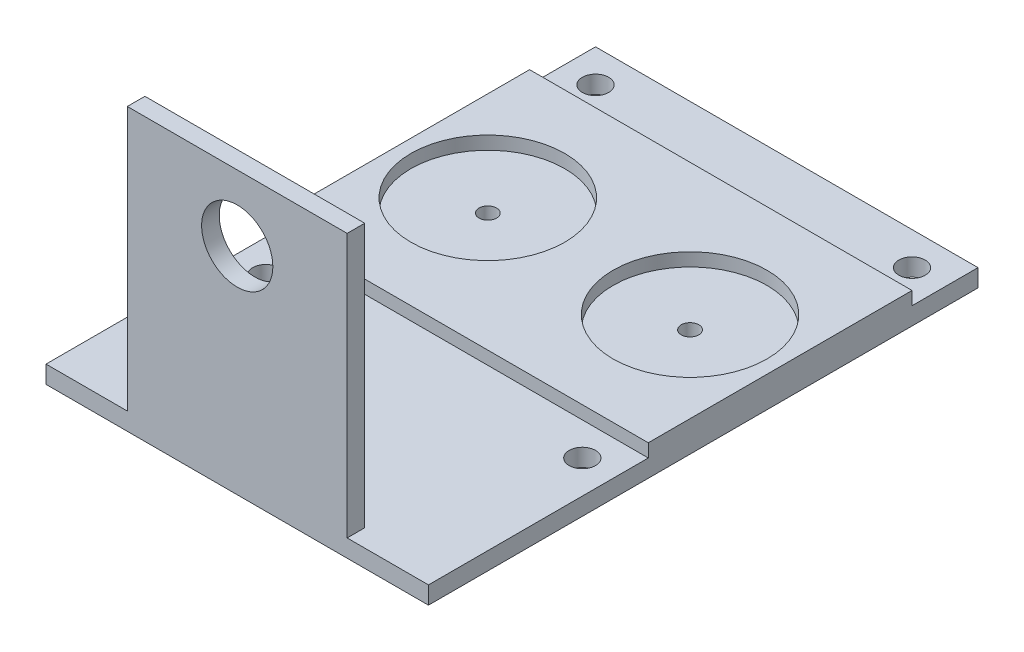
ISO-10303-21;
HEADER;
FILE_DESCRIPTION(('STEP AP214'),'2;1');
FILE_NAME('part.step','',(''),(''),'','','');
FILE_SCHEMA(('AUTOMOTIVE_DESIGN { 1 0 10303 214 1 1 1 1 }'));
ENDSEC;
DATA;
#1=APPLICATION_CONTEXT('core data for automotive mechanical design processes');
#2=APPLICATION_PROTOCOL_DEFINITION('international standard','automotive_design',2000,#1);
#3=PRODUCT_CONTEXT('',#1,'mechanical');
#4=PRODUCT('Part','Part','',(#3));
#5=PRODUCT_RELATED_PRODUCT_CATEGORY('part','',(#4));
#6=PRODUCT_DEFINITION_FORMATION('','',#4);
#7=PRODUCT_DEFINITION_CONTEXT('part definition',#1,'design');
#8=PRODUCT_DEFINITION('design','',#6,#7);
#9=PRODUCT_DEFINITION_SHAPE('','',#8);
#10=(LENGTH_UNIT() NAMED_UNIT(*) SI_UNIT(.MILLI.,.METRE.));
#11=(NAMED_UNIT(*) PLANE_ANGLE_UNIT() SI_UNIT($,.RADIAN.));
#12=(NAMED_UNIT(*) SI_UNIT($,.STERADIAN.) SOLID_ANGLE_UNIT());
#13=UNCERTAINTY_MEASURE_WITH_UNIT(LENGTH_MEASURE(1.E-05),#10,'distance_accuracy_value','');
#14=(GEOMETRIC_REPRESENTATION_CONTEXT(3) GLOBAL_UNCERTAINTY_ASSIGNED_CONTEXT((#13)) GLOBAL_UNIT_ASSIGNED_CONTEXT((#10,
#11,#12)) REPRESENTATION_CONTEXT('',''));
#15=CARTESIAN_POINT('',(0.,0.,0.));
#16=DIRECTION('',(0.,0.,1.));
#17=DIRECTION('',(1.,0.,0.));
#18=AXIS2_PLACEMENT_3D('',#15,#16,#17);
#19=CARTESIAN_POINT('',(0.,4.,0.));
#20=DIRECTION('',(0.,1.,0.));
#21=DIRECTION('',(0.,0.,1.));
#22=AXIS2_PLACEMENT_3D('',#19,#20,#21);
#23=PLANE('',#22);
#24=DIRECTION('',(-1.,0.,0.));
#25=VECTOR('',#24,1.);
#26=CARTESIAN_POINT('',(-43.5,4.,-30.));
#27=LINE('',#26,#25);
#28=CARTESIAN_POINT('',(43.5,4.,-30.));
#29=VERTEX_POINT('',#28);
#30=CARTESIAN_POINT('',(-43.5,4.,-30.));
#31=VERTEX_POINT('',#30);
#32=EDGE_CURVE('E193',#29,#31,#27,.T.);
#33=ORIENTED_EDGE('',*,*,#32,.F.);
#34=DIRECTION('',(0.,0.,1.));
#35=VECTOR('',#34,1.);
#36=CARTESIAN_POINT('',(43.5,4.,0.));
#37=LINE('',#36,#35);
#38=CARTESIAN_POINT('',(43.5,4.,-45.));
#39=VERTEX_POINT('',#38);
#40=EDGE_CURVE('E240',#39,#29,#37,.T.);
#41=ORIENTED_EDGE('',*,*,#40,.F.);
#42=DIRECTION('',(1.,0.,0.));
#43=VECTOR('',#42,1.);
#44=CARTESIAN_POINT('',(0.,4.,-45.));
#45=LINE('',#44,#43);
#46=CARTESIAN_POINT('',(-43.5,4.,-45.));
#47=VERTEX_POINT('',#46);
#48=EDGE_CURVE('E244',#47,#39,#45,.T.);
#49=ORIENTED_EDGE('',*,*,#48,.F.);
#50=DIRECTION('',(0.,0.,1.));
#51=VECTOR('',#50,1.);
#52=CARTESIAN_POINT('',(-43.5,4.,0.));
#53=LINE('',#52,#51);
#54=EDGE_CURVE('E262',#47,#31,#53,.T.);
#55=ORIENTED_EDGE('',*,*,#54,.T.);
#56=EDGE_LOOP('',(#33,#41,#49,#55));
#57=FACE_BOUND('',#56,.T.);
#58=CARTESIAN_POINT('',(-36.,4.,-37.5));
#59=DIRECTION('',(0.,1.,0.));
#60=DIRECTION('',(0.,0.,1.));
#61=AXIS2_PLACEMENT_3D('',#58,#59,#60);
#62=CIRCLE('',#61,3.);
#63=CARTESIAN_POINT('',(-36.,4.,-34.5));
#64=VERTEX_POINT('',#63);
#65=EDGE_CURVE('E605',#64,#64,#62,.T.);
#66=ORIENTED_EDGE('',*,*,#65,.F.);
#67=EDGE_LOOP('',(#66));
#68=FACE_BOUND('',#67,.T.);
#69=CARTESIAN_POINT('',(36.,4.,-37.5));
#70=DIRECTION('',(0.,1.,0.));
#71=DIRECTION('',(0.,0.,1.));
#72=AXIS2_PLACEMENT_3D('',#69,#70,#71);
#73=CIRCLE('',#72,3.);
#74=CARTESIAN_POINT('',(36.,4.,-34.5));
#75=VERTEX_POINT('',#74);
#76=EDGE_CURVE('E289',#75,#75,#73,.T.);
#77=ORIENTED_EDGE('',*,*,#76,.F.);
#78=EDGE_LOOP('',(#77));
#79=FACE_BOUND('',#78,.T.);
#80=ADVANCED_FACE('F36',(#57,#68,#79),#23,.T.);
#81=CARTESIAN_POINT('',(43.5,4.,0.));
#82=DIRECTION('',(1.,0.,0.));
#83=DIRECTION('',(0.,0.,-1.));
#84=AXIS2_PLACEMENT_3D('',#81,#82,#83);
#85=PLANE('',#84);
#86=DIRECTION('',(0.,0.,1.));
#87=VECTOR('',#86,1.);
#88=CARTESIAN_POINT('',(43.5,0.,0.));
#89=LINE('',#88,#87);
#90=CARTESIAN_POINT('',(43.5,0.,-45.));
#91=VERTEX_POINT('',#90);
#92=CARTESIAN_POINT('',(43.5,0.,80.));
#93=VERTEX_POINT('',#92);
#94=EDGE_CURVE('E294',#91,#93,#89,.T.);
#95=ORIENTED_EDGE('',*,*,#94,.F.);
#96=DIRECTION('',(0.,-1.,0.));
#97=VECTOR('',#96,1.);
#98=CARTESIAN_POINT('',(43.5,4.,-45.));
#99=LINE('',#98,#97);
#100=EDGE_CURVE('E11',#39,#91,#99,.T.);
#101=ORIENTED_EDGE('',*,*,#100,.F.);
#102=ORIENTED_EDGE('',*,*,#40,.T.);
#103=DIRECTION('',(0.,-1.,0.));
#104=VECTOR('',#103,1.);
#105=CARTESIAN_POINT('',(43.5,7.,-30.));
#106=LINE('',#105,#104);
#107=CARTESIAN_POINT('',(43.5,7.,-30.));
#108=VERTEX_POINT('',#107);
#109=EDGE_CURVE('E215',#108,#29,#106,.T.);
#110=ORIENTED_EDGE('',*,*,#109,.F.);
#111=DIRECTION('',(0.,0.,-1.));
#112=VECTOR('',#111,1.);
#113=CARTESIAN_POINT('',(43.5,7.,-30.));
#114=LINE('',#113,#112);
#115=CARTESIAN_POINT('',(43.5,7.,30.));
#116=VERTEX_POINT('',#115);
#117=EDGE_CURVE('E195',#116,#108,#114,.T.);
#118=ORIENTED_EDGE('',*,*,#117,.F.);
#119=DIRECTION('',(0.,-1.,0.));
#120=VECTOR('',#119,1.);
#121=CARTESIAN_POINT('',(43.5,7.,30.));
#122=LINE('',#121,#120);
#123=CARTESIAN_POINT('',(43.5,4.,30.));
#124=VERTEX_POINT('',#123);
#125=EDGE_CURVE('E211',#116,#124,#122,.T.);
#126=ORIENTED_EDGE('',*,*,#125,.T.);
#127=CARTESIAN_POINT('',(43.5,4.,80.));
#128=VERTEX_POINT('',#127);
#129=EDGE_CURVE('E245',#124,#128,#37,.T.);
#130=ORIENTED_EDGE('',*,*,#129,.T.);
#131=DIRECTION('',(0.,-1.,0.));
#132=VECTOR('',#131,1.);
#133=CARTESIAN_POINT('',(43.5,4.,80.));
#134=LINE('',#133,#132);
#135=EDGE_CURVE('E280',#128,#93,#134,.T.);
#136=ORIENTED_EDGE('',*,*,#135,.T.);
#137=EDGE_LOOP('',(#95,#101,#102,#110,#118,#126,#130,#136));
#138=FACE_BOUND('',#137,.T.);
#139=ADVANCED_FACE('F238',(#138),#85,.T.);
#140=CARTESIAN_POINT('',(0.,4.,-45.));
#141=DIRECTION('',(0.,0.,-1.));
#142=DIRECTION('',(-1.,0.,0.));
#143=AXIS2_PLACEMENT_3D('',#140,#141,#142);
#144=PLANE('',#143);
#145=DIRECTION('',(1.,0.,0.));
#146=VECTOR('',#145,1.);
#147=CARTESIAN_POINT('',(0.,0.,-45.));
#148=LINE('',#147,#146);
#149=CARTESIAN_POINT('',(-43.5,0.,-45.));
#150=VERTEX_POINT('',#149);
#151=EDGE_CURVE('E291',#150,#91,#148,.T.);
#152=ORIENTED_EDGE('',*,*,#151,.F.);
#153=DIRECTION('',(0.,-1.,0.));
#154=VECTOR('',#153,1.);
#155=CARTESIAN_POINT('',(-43.5,4.,-45.));
#156=LINE('',#155,#154);
#157=EDGE_CURVE('E45',#47,#150,#156,.T.);
#158=ORIENTED_EDGE('',*,*,#157,.F.);
#159=ORIENTED_EDGE('',*,*,#48,.T.);
#160=ORIENTED_EDGE('',*,*,#100,.T.);
#161=EDGE_LOOP('',(#152,#158,#159,#160));
#162=FACE_BOUND('',#161,.T.);
#163=ADVANCED_FACE('F329',(#162),#144,.T.);
#164=CARTESIAN_POINT('',(-43.5,4.,0.));
#165=DIRECTION('',(1.,0.,0.));
#166=DIRECTION('',(0.,0.,-1.));
#167=AXIS2_PLACEMENT_3D('',#164,#165,#166);
#168=PLANE('',#167);
#169=DIRECTION('',(0.,0.,1.));
#170=VECTOR('',#169,1.);
#171=CARTESIAN_POINT('',(-43.5,0.,0.));
#172=LINE('',#171,#170);
#173=CARTESIAN_POINT('',(-43.5,0.,80.));
#174=VERTEX_POINT('',#173);
#175=EDGE_CURVE('E283',#150,#174,#172,.T.);
#176=ORIENTED_EDGE('',*,*,#175,.T.);
#177=DIRECTION('',(0.,-1.,0.));
#178=VECTOR('',#177,1.);
#179=CARTESIAN_POINT('',(-43.5,4.,80.));
#180=LINE('',#179,#178);
#181=CARTESIAN_POINT('',(-43.5,4.,80.));
#182=VERTEX_POINT('',#181);
#183=EDGE_CURVE('E277',#182,#174,#180,.T.);
#184=ORIENTED_EDGE('',*,*,#183,.F.);
#185=CARTESIAN_POINT('',(-43.5,4.,30.));
#186=VERTEX_POINT('',#185);
#187=EDGE_CURVE('E208',#186,#182,#53,.T.);
#188=ORIENTED_EDGE('',*,*,#187,.F.);
#189=DIRECTION('',(0.,-1.,0.));
#190=VECTOR('',#189,1.);
#191=CARTESIAN_POINT('',(-43.5,7.,30.));
#192=LINE('',#191,#190);
#193=CARTESIAN_POINT('',(-43.5,7.,30.));
#194=VERTEX_POINT('',#193);
#195=EDGE_CURVE('E214',#194,#186,#192,.T.);
#196=ORIENTED_EDGE('',*,*,#195,.F.);
#197=DIRECTION('',(0.,0.,1.));
#198=VECTOR('',#197,1.);
#199=CARTESIAN_POINT('',(-43.5,7.,-30.));
#200=LINE('',#199,#198);
#201=CARTESIAN_POINT('',(-43.5,7.,-30.));
#202=VERTEX_POINT('',#201);
#203=EDGE_CURVE('E189',#202,#194,#200,.T.);
#204=ORIENTED_EDGE('',*,*,#203,.F.);
#205=DIRECTION('',(0.,-1.,0.));
#206=VECTOR('',#205,1.);
#207=CARTESIAN_POINT('',(-43.5,7.,-30.));
#208=LINE('',#207,#206);
#209=EDGE_CURVE('E199',#202,#31,#208,.T.);
#210=ORIENTED_EDGE('',*,*,#209,.T.);
#211=ORIENTED_EDGE('',*,*,#54,.F.);
#212=ORIENTED_EDGE('',*,*,#157,.T.);
#213=EDGE_LOOP('',(#176,#184,#188,#196,#204,#210,#211,#212));
#214=FACE_BOUND('',#213,.T.);
#215=ADVANCED_FACE('F281',(#214),#168,.F.);
#216=CARTESIAN_POINT('',(-36.,4.,37.5));
#217=DIRECTION('',(0.,-1.,0.));
#218=DIRECTION('',(0.,0.,-1.));
#219=AXIS2_PLACEMENT_3D('',#216,#217,#218);
#220=CYLINDRICAL_SURFACE('',#219,3.);
#221=CARTESIAN_POINT('',(-36.,4.,37.5));
#222=DIRECTION('',(0.,1.,0.));
#223=DIRECTION('',(0.,0.,1.));
#224=AXIS2_PLACEMENT_3D('',#221,#222,#223);
#225=CIRCLE('',#224,3.);
#226=CARTESIAN_POINT('',(-36.,4.,40.5));
#227=VERTEX_POINT('',#226);
#228=EDGE_CURVE('E249',#227,#227,#225,.T.);
#229=ORIENTED_EDGE('',*,*,#228,.T.);
#230=EDGE_LOOP('',(#229));
#231=FACE_BOUND('',#230,.T.);
#232=CARTESIAN_POINT('',(-36.,0.,37.5));
#233=DIRECTION('',(0.,1.,0.));
#234=DIRECTION('',(0.,0.,1.));
#235=AXIS2_PLACEMENT_3D('',#232,#233,#234);
#236=CIRCLE('',#235,3.);
#237=CARTESIAN_POINT('',(-36.,0.,40.5));
#238=VERTEX_POINT('',#237);
#239=EDGE_CURVE('E297',#238,#238,#236,.T.);
#240=ORIENTED_EDGE('',*,*,#239,.F.);
#241=EDGE_LOOP('',(#240));
#242=FACE_BOUND('',#241,.T.);
#243=ADVANCED_FACE('F364',(#231,#242),#220,.F.);
#244=CARTESIAN_POINT('',(36.,4.,37.5));
#245=DIRECTION('',(0.,-1.,0.));
#246=DIRECTION('',(0.,0.,-1.));
#247=AXIS2_PLACEMENT_3D('',#244,#245,#246);
#248=CYLINDRICAL_SURFACE('',#247,3.);
#249=CARTESIAN_POINT('',(36.,4.,37.5));
#250=DIRECTION('',(0.,1.,0.));
#251=DIRECTION('',(0.,0.,1.));
#252=AXIS2_PLACEMENT_3D('',#249,#250,#251);
#253=CIRCLE('',#252,3.);
#254=CARTESIAN_POINT('',(36.,4.,40.5));
#255=VERTEX_POINT('',#254);
#256=EDGE_CURVE('E378',#255,#255,#253,.T.);
#257=ORIENTED_EDGE('',*,*,#256,.T.);
#258=EDGE_LOOP('',(#257));
#259=FACE_BOUND('',#258,.T.);
#260=CARTESIAN_POINT('',(36.,0.,37.5));
#261=DIRECTION('',(0.,1.,0.));
#262=DIRECTION('',(0.,0.,1.));
#263=AXIS2_PLACEMENT_3D('',#260,#261,#262);
#264=CIRCLE('',#263,3.);
#265=CARTESIAN_POINT('',(36.,0.,40.5));
#266=VERTEX_POINT('',#265);
#267=EDGE_CURVE('E300',#266,#266,#264,.T.);
#268=ORIENTED_EDGE('',*,*,#267,.F.);
#269=EDGE_LOOP('',(#268));
#270=FACE_BOUND('',#269,.T.);
#271=ADVANCED_FACE('F319',(#259,#270),#248,.F.);
#272=CARTESIAN_POINT('',(-36.,4.,-37.5));
#273=DIRECTION('',(0.,-1.,0.));
#274=DIRECTION('',(0.,0.,-1.));
#275=AXIS2_PLACEMENT_3D('',#272,#273,#274);
#276=CYLINDRICAL_SURFACE('',#275,3.);
#277=ORIENTED_EDGE('',*,*,#65,.T.);
#278=EDGE_LOOP('',(#277));
#279=FACE_BOUND('',#278,.T.);
#280=CARTESIAN_POINT('',(-36.,0.,-37.5));
#281=DIRECTION('',(0.,1.,0.));
#282=DIRECTION('',(0.,0.,1.));
#283=AXIS2_PLACEMENT_3D('',#280,#281,#282);
#284=CIRCLE('',#283,3.);
#285=CARTESIAN_POINT('',(-36.,0.,-34.5));
#286=VERTEX_POINT('',#285);
#287=EDGE_CURVE('E303',#286,#286,#284,.T.);
#288=ORIENTED_EDGE('',*,*,#287,.F.);
#289=EDGE_LOOP('',(#288));
#290=FACE_BOUND('',#289,.T.);
#291=ADVANCED_FACE('F312',(#279,#290),#276,.F.);
#292=CARTESIAN_POINT('',(36.,4.,-37.5));
#293=DIRECTION('',(0.,-1.,0.));
#294=DIRECTION('',(0.,0.,-1.));
#295=AXIS2_PLACEMENT_3D('',#292,#293,#294);
#296=CYLINDRICAL_SURFACE('',#295,3.);
#297=ORIENTED_EDGE('',*,*,#76,.T.);
#298=EDGE_LOOP('',(#297));
#299=FACE_BOUND('',#298,.T.);
#300=CARTESIAN_POINT('',(36.,0.,-37.5));
#301=DIRECTION('',(0.,1.,0.));
#302=DIRECTION('',(0.,0.,1.));
#303=AXIS2_PLACEMENT_3D('',#300,#301,#302);
#304=CIRCLE('',#303,3.);
#305=CARTESIAN_POINT('',(36.,0.,-34.5));
#306=VERTEX_POINT('',#305);
#307=EDGE_CURVE('E220',#306,#306,#304,.T.);
#308=ORIENTED_EDGE('',*,*,#307,.F.);
#309=EDGE_LOOP('',(#308));
#310=FACE_BOUND('',#309,.T.);
#311=ADVANCED_FACE('F38',(#299,#310),#296,.F.);
#312=CARTESIAN_POINT('',(0.,4.,80.));
#313=DIRECTION('',(0.,0.,-1.));
#314=DIRECTION('',(-1.,0.,0.));
#315=AXIS2_PLACEMENT_3D('',#312,#313,#314);
#316=PLANE('',#315);
#317=DIRECTION('',(1.,0.,0.));
#318=VECTOR('',#317,1.);
#319=CARTESIAN_POINT('',(0.,0.,80.));
#320=LINE('',#319,#318);
#321=EDGE_CURVE('E287',#174,#93,#320,.T.);
#322=ORIENTED_EDGE('',*,*,#321,.T.);
#323=ORIENTED_EDGE('',*,*,#135,.F.);
#324=DIRECTION('',(1.,0.,0.));
#325=VECTOR('',#324,1.);
#326=CARTESIAN_POINT('',(0.,4.,80.));
#327=LINE('',#326,#325);
#328=CARTESIAN_POINT('',(25.,4.,80.));
#329=VERTEX_POINT('',#328);
#330=EDGE_CURVE('E263',#329,#128,#327,.T.);
#331=ORIENTED_EDGE('',*,*,#330,.F.);
#332=DIRECTION('',(0.,1.,0.));
#333=VECTOR('',#332,1.);
#334=CARTESIAN_POINT('',(25.,4.,80.));
#335=LINE('',#334,#333);
#336=CARTESIAN_POINT('',(25.,64.,80.));
#337=VERTEX_POINT('',#336);
#338=EDGE_CURVE('E157',#329,#337,#335,.T.);
#339=ORIENTED_EDGE('',*,*,#338,.T.);
#340=DIRECTION('',(-1.,0.,0.));
#341=VECTOR('',#340,1.);
#342=CARTESIAN_POINT('',(25.,64.,80.));
#343=LINE('',#342,#341);
#344=CARTESIAN_POINT('',(-25.,64.,80.));
#345=VERTEX_POINT('',#344);
#346=EDGE_CURVE('E131',#337,#345,#343,.T.);
#347=ORIENTED_EDGE('',*,*,#346,.T.);
#348=DIRECTION('',(0.,-1.,0.));
#349=VECTOR('',#348,1.);
#350=CARTESIAN_POINT('',(-25.,4.,80.));
#351=LINE('',#350,#349);
#352=CARTESIAN_POINT('',(-25.,4.,80.));
#353=VERTEX_POINT('',#352);
#354=EDGE_CURVE('E147',#345,#353,#351,.T.);
#355=ORIENTED_EDGE('',*,*,#354,.T.);
#356=EDGE_CURVE('E259',#182,#353,#327,.T.);
#357=ORIENTED_EDGE('',*,*,#356,.F.);
#358=ORIENTED_EDGE('',*,*,#183,.T.);
#359=EDGE_LOOP('',(#322,#323,#331,#339,#347,#355,#357,#358));
#360=FACE_BOUND('',#359,.T.);
#361=CARTESIAN_POINT('',(0.,49.,80.));
#362=DIRECTION('',(0.,0.,1.));
#363=DIRECTION('',(1.,0.,0.));
#364=AXIS2_PLACEMENT_3D('',#361,#362,#363);
#365=CIRCLE('',#364,8.1);
#366=CARTESIAN_POINT('',(8.1,49.,80.));
#367=VERTEX_POINT('',#366);
#368=EDGE_CURVE('E152',#367,#367,#365,.T.);
#369=ORIENTED_EDGE('',*,*,#368,.F.);
#370=EDGE_LOOP('',(#369));
#371=FACE_BOUND('',#370,.T.);
#372=ADVANCED_FACE('F275',(#360,#371),#316,.F.);
#373=DIRECTION('',(0.,0.,1.));
#374=VECTOR('',#373,1.);
#375=CARTESIAN_POINT('',(25.,4.,76.));
#376=LINE('',#375,#374);
#377=CARTESIAN_POINT('',(25.,4.,76.));
#378=VERTEX_POINT('',#377);
#379=EDGE_CURVE('E146',#378,#329,#376,.T.);
#380=ORIENTED_EDGE('',*,*,#379,.T.);
#381=ORIENTED_EDGE('',*,*,#330,.T.);
#382=ORIENTED_EDGE('',*,*,#129,.F.);
#383=DIRECTION('',(1.,0.,0.));
#384=VECTOR('',#383,1.);
#385=CARTESIAN_POINT('',(-43.5,4.,30.));
#386=LINE('',#385,#384);
#387=EDGE_CURVE('E186',#186,#124,#386,.T.);
#388=ORIENTED_EDGE('',*,*,#387,.F.);
#389=ORIENTED_EDGE('',*,*,#187,.T.);
#390=ORIENTED_EDGE('',*,*,#356,.T.);
#391=DIRECTION('',(0.,0.,1.));
#392=VECTOR('',#391,1.);
#393=CARTESIAN_POINT('',(-25.,4.,76.));
#394=LINE('',#393,#392);
#395=CARTESIAN_POINT('',(-25.,4.,76.));
#396=VERTEX_POINT('',#395);
#397=EDGE_CURVE('E58',#396,#353,#394,.T.);
#398=ORIENTED_EDGE('',*,*,#397,.F.);
#399=DIRECTION('',(1.,0.,0.));
#400=VECTOR('',#399,1.);
#401=CARTESIAN_POINT('',(25.,4.,76.));
#402=LINE('',#401,#400);
#403=EDGE_CURVE('E53',#396,#378,#402,.T.);
#404=ORIENTED_EDGE('',*,*,#403,.T.);
#405=EDGE_LOOP('',(#380,#381,#382,#388,#389,#390,#398,#404));
#406=FACE_BOUND('',#405,.T.);
#407=ORIENTED_EDGE('',*,*,#256,.F.);
#408=EDGE_LOOP('',(#407));
#409=FACE_BOUND('',#408,.T.);
#410=ORIENTED_EDGE('',*,*,#228,.F.);
#411=EDGE_LOOP('',(#410));
#412=FACE_BOUND('',#411,.T.);
#413=ADVANCED_FACE('F267',(#406,#409,#412),#23,.T.);
#414=CARTESIAN_POINT('',(0.,0.,0.));
#415=DIRECTION('',(0.,1.,0.));
#416=DIRECTION('',(0.,0.,1.));
#417=AXIS2_PLACEMENT_3D('',#414,#415,#416);
#418=PLANE('',#417);
#419=CARTESIAN_POINT('',(-23.,0.,0.));
#420=DIRECTION('',(0.,1.,0.));
#421=DIRECTION('',(0.,0.,1.));
#422=AXIS2_PLACEMENT_3D('',#419,#420,#421);
#423=CIRCLE('',#422,2.);
#424=CARTESIAN_POINT('',(-23.,0.,2.));
#425=VERTEX_POINT('',#424);
#426=EDGE_CURVE('E165',#425,#425,#423,.T.);
#427=ORIENTED_EDGE('',*,*,#426,.T.);
#428=EDGE_LOOP('',(#427));
#429=FACE_BOUND('',#428,.T.);
#430=CARTESIAN_POINT('',(23.,0.,0.));
#431=DIRECTION('',(0.,1.,0.));
#432=DIRECTION('',(0.,0.,1.));
#433=AXIS2_PLACEMENT_3D('',#430,#431,#432);
#434=CIRCLE('',#433,2.);
#435=CARTESIAN_POINT('',(23.,0.,2.));
#436=VERTEX_POINT('',#435);
#437=EDGE_CURVE('E171',#436,#436,#434,.T.);
#438=ORIENTED_EDGE('',*,*,#437,.T.);
#439=EDGE_LOOP('',(#438));
#440=FACE_BOUND('',#439,.T.);
#441=ORIENTED_EDGE('',*,*,#307,.T.);
#442=EDGE_LOOP('',(#441));
#443=FACE_BOUND('',#442,.T.);
#444=ORIENTED_EDGE('',*,*,#287,.T.);
#445=EDGE_LOOP('',(#444));
#446=FACE_BOUND('',#445,.T.);
#447=ORIENTED_EDGE('',*,*,#267,.T.);
#448=EDGE_LOOP('',(#447));
#449=FACE_BOUND('',#448,.T.);
#450=ORIENTED_EDGE('',*,*,#239,.T.);
#451=EDGE_LOOP('',(#450));
#452=FACE_BOUND('',#451,.T.);
#453=ORIENTED_EDGE('',*,*,#94,.T.);
#454=ORIENTED_EDGE('',*,*,#321,.F.);
#455=ORIENTED_EDGE('',*,*,#175,.F.);
#456=ORIENTED_EDGE('',*,*,#151,.T.);
#457=EDGE_LOOP('',(#453,#454,#455,#456));
#458=FACE_BOUND('',#457,.T.);
#459=ADVANCED_FACE('F308',(#429,#440,#443,#446,#449,#452,#458),#418,.F.);
#460=CARTESIAN_POINT('',(0.,7.,0.));
#461=DIRECTION('',(0.,1.,0.));
#462=DIRECTION('',(0.,0.,1.));
#463=AXIS2_PLACEMENT_3D('',#460,#461,#462);
#464=PLANE('',#463);
#465=CARTESIAN_POINT('',(-23.,7.,0.));
#466=DIRECTION('',(0.,1.,0.));
#467=DIRECTION('',(0.,0.,1.));
#468=AXIS2_PLACEMENT_3D('',#465,#466,#467);
#469=CIRCLE('',#468,17.5);
#470=CARTESIAN_POINT('',(-23.,7.,17.5));
#471=VERTEX_POINT('',#470);
#472=EDGE_CURVE('E183',#471,#471,#469,.T.);
#473=ORIENTED_EDGE('',*,*,#472,.F.);
#474=EDGE_LOOP('',(#473));
#475=FACE_BOUND('',#474,.T.);
#476=ORIENTED_EDGE('',*,*,#203,.T.);
#477=DIRECTION('',(1.,0.,0.));
#478=VECTOR('',#477,1.);
#479=CARTESIAN_POINT('',(-43.5,7.,30.));
#480=LINE('',#479,#478);
#481=EDGE_CURVE('E192',#194,#116,#480,.T.);
#482=ORIENTED_EDGE('',*,*,#481,.T.);
#483=ORIENTED_EDGE('',*,*,#117,.T.);
#484=DIRECTION('',(-1.,0.,0.));
#485=VECTOR('',#484,1.);
#486=CARTESIAN_POINT('',(-43.5,7.,-30.));
#487=LINE('',#486,#485);
#488=EDGE_CURVE('E197',#108,#202,#487,.T.);
#489=ORIENTED_EDGE('',*,*,#488,.T.);
#490=EDGE_LOOP('',(#476,#482,#483,#489));
#491=FACE_BOUND('',#490,.T.);
#492=CARTESIAN_POINT('',(23.,7.,0.));
#493=DIRECTION('',(0.,1.,0.));
#494=DIRECTION('',(0.,0.,1.));
#495=AXIS2_PLACEMENT_3D('',#492,#493,#494);
#496=CIRCLE('',#495,17.5);
#497=CARTESIAN_POINT('',(23.,7.,17.5));
#498=VERTEX_POINT('',#497);
#499=EDGE_CURVE('E177',#498,#498,#496,.T.);
#500=ORIENTED_EDGE('',*,*,#499,.F.);
#501=EDGE_LOOP('',(#500));
#502=FACE_BOUND('',#501,.T.);
#503=ADVANCED_FACE('F352',(#475,#491,#502),#464,.T.);
#504=CARTESIAN_POINT('',(-43.5,7.,30.));
#505=DIRECTION('',(0.,0.,-1.));
#506=DIRECTION('',(-1.,0.,0.));
#507=AXIS2_PLACEMENT_3D('',#504,#505,#506);
#508=PLANE('',#507);
#509=ORIENTED_EDGE('',*,*,#387,.T.);
#510=ORIENTED_EDGE('',*,*,#125,.F.);
#511=ORIENTED_EDGE('',*,*,#481,.F.);
#512=ORIENTED_EDGE('',*,*,#195,.T.);
#513=EDGE_LOOP('',(#509,#510,#511,#512));
#514=FACE_BOUND('',#513,.T.);
#515=ADVANCED_FACE('F357',(#514),#508,.F.);
#516=CARTESIAN_POINT('',(-43.5,7.,-30.));
#517=DIRECTION('',(0.,0.,1.));
#518=DIRECTION('',(1.,0.,0.));
#519=AXIS2_PLACEMENT_3D('',#516,#517,#518);
#520=PLANE('',#519);
#521=ORIENTED_EDGE('',*,*,#32,.T.);
#522=ORIENTED_EDGE('',*,*,#209,.F.);
#523=ORIENTED_EDGE('',*,*,#488,.F.);
#524=ORIENTED_EDGE('',*,*,#109,.T.);
#525=EDGE_LOOP('',(#521,#522,#523,#524));
#526=FACE_BOUND('',#525,.T.);
#527=ADVANCED_FACE('F232',(#526),#520,.F.);
#528=CARTESIAN_POINT('',(-23.,7.,0.));
#529=DIRECTION('',(0.,-1.,0.));
#530=DIRECTION('',(0.,0.,-1.));
#531=AXIS2_PLACEMENT_3D('',#528,#529,#530);
#532=CYLINDRICAL_SURFACE('',#531,17.5);
#533=ORIENTED_EDGE('',*,*,#472,.T.);
#534=EDGE_LOOP('',(#533));
#535=FACE_BOUND('',#534,.T.);
#536=CARTESIAN_POINT('',(-23.,4.,0.));
#537=DIRECTION('',(0.,1.,0.));
#538=DIRECTION('',(0.,0.,1.));
#539=AXIS2_PLACEMENT_3D('',#536,#537,#538);
#540=CIRCLE('',#539,17.5);
#541=CARTESIAN_POINT('',(-23.,4.,17.5));
#542=VERTEX_POINT('',#541);
#543=EDGE_CURVE('E180',#542,#542,#540,.T.);
#544=ORIENTED_EDGE('',*,*,#543,.F.);
#545=EDGE_LOOP('',(#544));
#546=FACE_BOUND('',#545,.T.);
#547=ADVANCED_FACE('F343',(#535,#546),#532,.F.);
#548=CARTESIAN_POINT('',(23.,7.,0.));
#549=DIRECTION('',(0.,-1.,0.));
#550=DIRECTION('',(0.,0.,-1.));
#551=AXIS2_PLACEMENT_3D('',#548,#549,#550);
#552=CYLINDRICAL_SURFACE('',#551,17.5);
#553=ORIENTED_EDGE('',*,*,#499,.T.);
#554=EDGE_LOOP('',(#553));
#555=FACE_BOUND('',#554,.T.);
#556=CARTESIAN_POINT('',(23.,4.,0.));
#557=DIRECTION('',(0.,1.,0.));
#558=DIRECTION('',(0.,0.,1.));
#559=AXIS2_PLACEMENT_3D('',#556,#557,#558);
#560=CIRCLE('',#559,17.5);
#561=CARTESIAN_POINT('',(23.,4.,17.5));
#562=VERTEX_POINT('',#561);
#563=EDGE_CURVE('E174',#562,#562,#560,.T.);
#564=ORIENTED_EDGE('',*,*,#563,.F.);
#565=EDGE_LOOP('',(#564));
#566=FACE_BOUND('',#565,.T.);
#567=ADVANCED_FACE('F338',(#555,#566),#552,.F.);
#568=CARTESIAN_POINT('',(-23.,4.,0.));
#569=DIRECTION('',(0.,1.,0.));
#570=DIRECTION('',(0.,0.,1.));
#571=AXIS2_PLACEMENT_3D('',#568,#569,#570);
#572=CIRCLE('',#571,2.);
#573=CARTESIAN_POINT('',(-23.,4.,2.));
#574=VERTEX_POINT('',#573);
#575=EDGE_CURVE('E162',#574,#574,#572,.T.);
#576=ORIENTED_EDGE('',*,*,#575,.F.);
#577=EDGE_LOOP('',(#576));
#578=FACE_BOUND('',#577,.T.);
#579=ORIENTED_EDGE('',*,*,#543,.T.);
#580=EDGE_LOOP('',(#579));
#581=FACE_BOUND('',#580,.T.);
#582=ADVANCED_FACE('F325',(#578,#581),#23,.T.);
#583=CARTESIAN_POINT('',(23.,4.,0.));
#584=DIRECTION('',(0.,1.,0.));
#585=DIRECTION('',(0.,0.,1.));
#586=AXIS2_PLACEMENT_3D('',#583,#584,#585);
#587=CIRCLE('',#586,2.);
#588=CARTESIAN_POINT('',(23.,4.,2.));
#589=VERTEX_POINT('',#588);
#590=EDGE_CURVE('E168',#589,#589,#587,.T.);
#591=ORIENTED_EDGE('',*,*,#590,.F.);
#592=EDGE_LOOP('',(#591));
#593=FACE_BOUND('',#592,.T.);
#594=ORIENTED_EDGE('',*,*,#563,.T.);
#595=EDGE_LOOP('',(#594));
#596=FACE_BOUND('',#595,.T.);
#597=ADVANCED_FACE('F324',(#593,#596),#23,.T.);
#598=CARTESIAN_POINT('',(23.,0.,0.));
#599=DIRECTION('',(0.,1.,0.));
#600=DIRECTION('',(0.,0.,1.));
#601=AXIS2_PLACEMENT_3D('',#598,#599,#600);
#602=CYLINDRICAL_SURFACE('',#601,2.);
#603=ORIENTED_EDGE('',*,*,#437,.F.);
#604=EDGE_LOOP('',(#603));
#605=FACE_BOUND('',#604,.T.);
#606=ORIENTED_EDGE('',*,*,#590,.T.);
#607=EDGE_LOOP('',(#606));
#608=FACE_BOUND('',#607,.T.);
#609=ADVANCED_FACE('F335',(#605,#608),#602,.F.);
#610=CARTESIAN_POINT('',(-23.,0.,0.));
#611=DIRECTION('',(0.,1.,0.));
#612=DIRECTION('',(0.,0.,1.));
#613=AXIS2_PLACEMENT_3D('',#610,#611,#612);
#614=CYLINDRICAL_SURFACE('',#613,2.);
#615=ORIENTED_EDGE('',*,*,#426,.F.);
#616=EDGE_LOOP('',(#615));
#617=FACE_BOUND('',#616,.T.);
#618=ORIENTED_EDGE('',*,*,#575,.T.);
#619=EDGE_LOOP('',(#618));
#620=FACE_BOUND('',#619,.T.);
#621=ADVANCED_FACE('F406',(#617,#620),#614,.F.);
#622=CARTESIAN_POINT('',(25.,4.,76.));
#623=DIRECTION('',(1.,0.,0.));
#624=DIRECTION('',(0.,0.,-1.));
#625=AXIS2_PLACEMENT_3D('',#622,#623,#624);
#626=PLANE('',#625);
#627=ORIENTED_EDGE('',*,*,#338,.F.);
#628=ORIENTED_EDGE('',*,*,#379,.F.);
#629=DIRECTION('',(0.,1.,0.));
#630=VECTOR('',#629,1.);
#631=CARTESIAN_POINT('',(25.,4.,76.));
#632=LINE('',#631,#630);
#633=CARTESIAN_POINT('',(25.,64.,76.));
#634=VERTEX_POINT('',#633);
#635=EDGE_CURVE('E142',#378,#634,#632,.T.);
#636=ORIENTED_EDGE('',*,*,#635,.T.);
#637=DIRECTION('',(0.,0.,1.));
#638=VECTOR('',#637,1.);
#639=CARTESIAN_POINT('',(25.,64.,76.));
#640=LINE('',#639,#638);
#641=EDGE_CURVE('E126',#634,#337,#640,.T.);
#642=ORIENTED_EDGE('',*,*,#641,.T.);
#643=EDGE_LOOP('',(#627,#628,#636,#642));
#644=FACE_BOUND('',#643,.T.);
#645=ADVANCED_FACE('F145',(#644),#626,.T.);
#646=CARTESIAN_POINT('',(-25.,4.,76.));
#647=DIRECTION('',(-1.,0.,0.));
#648=DIRECTION('',(0.,0.,1.));
#649=AXIS2_PLACEMENT_3D('',#646,#647,#648);
#650=PLANE('',#649);
#651=ORIENTED_EDGE('',*,*,#354,.F.);
#652=DIRECTION('',(0.,0.,1.));
#653=VECTOR('',#652,1.);
#654=CARTESIAN_POINT('',(-25.,64.,76.));
#655=LINE('',#654,#653);
#656=CARTESIAN_POINT('',(-25.,64.,76.));
#657=VERTEX_POINT('',#656);
#658=EDGE_CURVE('E136',#657,#345,#655,.T.);
#659=ORIENTED_EDGE('',*,*,#658,.F.);
#660=DIRECTION('',(0.,-1.,0.));
#661=VECTOR('',#660,1.);
#662=CARTESIAN_POINT('',(-25.,4.,76.));
#663=LINE('',#662,#661);
#664=EDGE_CURVE('E143',#657,#396,#663,.T.);
#665=ORIENTED_EDGE('',*,*,#664,.T.);
#666=ORIENTED_EDGE('',*,*,#397,.T.);
#667=EDGE_LOOP('',(#651,#659,#665,#666));
#668=FACE_BOUND('',#667,.T.);
#669=ADVANCED_FACE('F413',(#668),#650,.T.);
#670=CARTESIAN_POINT('',(25.,64.,76.));
#671=DIRECTION('',(0.,1.,0.));
#672=DIRECTION('',(0.,0.,1.));
#673=AXIS2_PLACEMENT_3D('',#670,#671,#672);
#674=PLANE('',#673);
#675=ORIENTED_EDGE('',*,*,#346,.F.);
#676=ORIENTED_EDGE('',*,*,#641,.F.);
#677=DIRECTION('',(-1.,0.,0.));
#678=VECTOR('',#677,1.);
#679=CARTESIAN_POINT('',(25.,64.,76.));
#680=LINE('',#679,#678);
#681=EDGE_CURVE('E129',#634,#657,#680,.T.);
#682=ORIENTED_EDGE('',*,*,#681,.T.);
#683=ORIENTED_EDGE('',*,*,#658,.T.);
#684=EDGE_LOOP('',(#675,#676,#682,#683));
#685=FACE_BOUND('',#684,.T.);
#686=ADVANCED_FACE('F128',(#685),#674,.T.);
#687=CARTESIAN_POINT('',(0.,0.,76.));
#688=DIRECTION('',(0.,0.,1.));
#689=DIRECTION('',(1.,0.,0.));
#690=AXIS2_PLACEMENT_3D('',#687,#688,#689);
#691=PLANE('',#690);
#692=CARTESIAN_POINT('',(0.,49.,76.));
#693=DIRECTION('',(0.,0.,1.));
#694=DIRECTION('',(1.,0.,0.));
#695=AXIS2_PLACEMENT_3D('',#692,#693,#694);
#696=CIRCLE('',#695,8.1);
#697=CARTESIAN_POINT('',(8.1,49.,76.));
#698=VERTEX_POINT('',#697);
#699=EDGE_CURVE('E159',#698,#698,#696,.T.);
#700=ORIENTED_EDGE('',*,*,#699,.T.);
#701=EDGE_LOOP('',(#700));
#702=FACE_BOUND('',#701,.T.);
#703=ORIENTED_EDGE('',*,*,#635,.F.);
#704=ORIENTED_EDGE('',*,*,#403,.F.);
#705=ORIENTED_EDGE('',*,*,#664,.F.);
#706=ORIENTED_EDGE('',*,*,#681,.F.);
#707=EDGE_LOOP('',(#703,#704,#705,#706));
#708=FACE_BOUND('',#707,.T.);
#709=ADVANCED_FACE('F141',(#702,#708),#691,.F.);
#710=CARTESIAN_POINT('',(0.,49.,76.));
#711=DIRECTION('',(0.,0.,1.));
#712=DIRECTION('',(1.,0.,0.));
#713=AXIS2_PLACEMENT_3D('',#710,#711,#712);
#714=CYLINDRICAL_SURFACE('',#713,8.1);
#715=ORIENTED_EDGE('',*,*,#699,.F.);
#716=EDGE_LOOP('',(#715));
#717=FACE_BOUND('',#716,.T.);
#718=ORIENTED_EDGE('',*,*,#368,.T.);
#719=EDGE_LOOP('',(#718));
#720=FACE_BOUND('',#719,.T.);
#721=ADVANCED_FACE('F421',(#717,#720),#714,.F.);
#722=CLOSED_SHELL('',(#80,#139,#163,#215,#243,#271,#291,#311,#372,#413,#459,#503,#515,#527,#547,
#567,#582,#597,#609,#621,#645,#669,#686,#709,#721));
#723=MANIFOLD_SOLID_BREP('B2',#722);
#724=ADVANCED_BREP_SHAPE_REPRESENTATION('',(#18,#723),#14);
#725=SHAPE_DEFINITION_REPRESENTATION(#9,#724);
ENDSEC;
END-ISO-10303-21;
